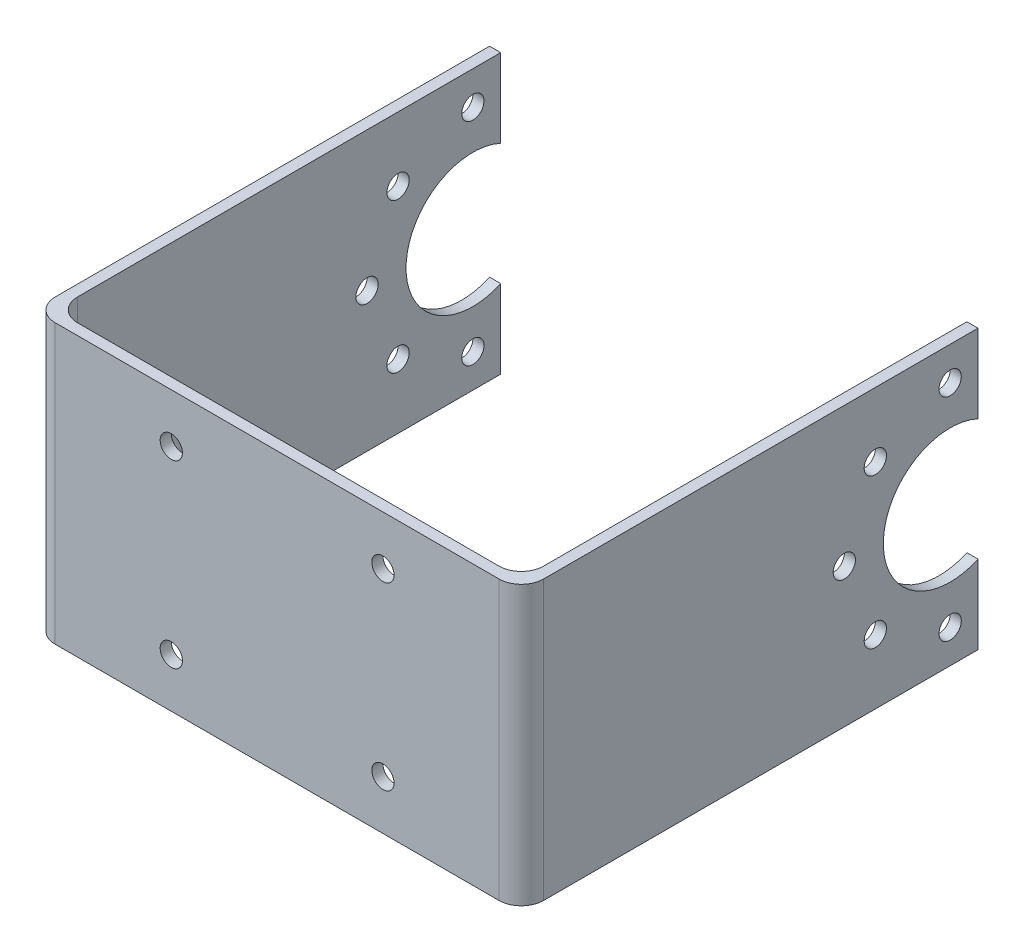
ISO-10303-21;
HEADER;
FILE_DESCRIPTION(('STEP AP214'),'2;1');
FILE_NAME('part.step','',(''),(''),'','','');
FILE_SCHEMA(('AUTOMOTIVE_DESIGN { 1 0 10303 214 1 1 1 1 }'));
ENDSEC;
DATA;
#1=APPLICATION_CONTEXT('core data for automotive mechanical design processes');
#2=APPLICATION_PROTOCOL_DEFINITION('international standard','automotive_design',2000,#1);
#3=PRODUCT_CONTEXT('',#1,'mechanical');
#4=PRODUCT('Part','Part','',(#3));
#5=PRODUCT_RELATED_PRODUCT_CATEGORY('part','',(#4));
#6=PRODUCT_DEFINITION_FORMATION('','',#4);
#7=PRODUCT_DEFINITION_CONTEXT('part definition',#1,'design');
#8=PRODUCT_DEFINITION('design','',#6,#7);
#9=PRODUCT_DEFINITION_SHAPE('','',#8);
#10=(LENGTH_UNIT() NAMED_UNIT(*) SI_UNIT(.MILLI.,.METRE.));
#11=(NAMED_UNIT(*) PLANE_ANGLE_UNIT() SI_UNIT($,.RADIAN.));
#12=(NAMED_UNIT(*) SI_UNIT($,.STERADIAN.) SOLID_ANGLE_UNIT());
#13=UNCERTAINTY_MEASURE_WITH_UNIT(LENGTH_MEASURE(1.E-05),#10,'distance_accuracy_value','');
#14=(GEOMETRIC_REPRESENTATION_CONTEXT(3) GLOBAL_UNCERTAINTY_ASSIGNED_CONTEXT((#13)) GLOBAL_UNIT_ASSIGNED_CONTEXT((#10,
#11,#12)) REPRESENTATION_CONTEXT('',''));
#15=CARTESIAN_POINT('',(0.,0.,0.));
#16=DIRECTION('',(0.,0.,1.));
#17=DIRECTION('',(1.,0.,0.));
#18=AXIS2_PLACEMENT_3D('',#15,#16,#17);
#19=CARTESIAN_POINT('',(21.3500000000001,25.,-40.5));
#20=DIRECTION('',(0.,0.,1.));
#21=DIRECTION('',(1.,0.,0.));
#22=AXIS2_PLACEMENT_3D('',#19,#20,#21);
#23=PLANE('',#22);
#24=DIRECTION('',(0.,-1.,0.));
#25=VECTOR('',#24,1.);
#26=CARTESIAN_POINT('',(20.3500000000001,25.,-40.5));
#27=LINE('',#26,#25);
#28=CARTESIAN_POINT('',(20.3500000000001,7.04564394268216,-40.5));
#29=VERTEX_POINT('',#28);
#30=CARTESIAN_POINT('',(20.3500000000001,0.,-40.5));
#31=VERTEX_POINT('',#30);
#32=EDGE_CURVE('E213',#29,#31,#27,.T.);
#33=ORIENTED_EDGE('',*,*,#32,.F.);
#34=DIRECTION('',(1.,0.,0.));
#35=VECTOR('',#34,1.);
#36=CARTESIAN_POINT('',(-22.4999999999999,7.04564394268215,-40.5));
#37=LINE('',#36,#35);
#38=CARTESIAN_POINT('',(21.3500000000001,7.04564394268215,-40.5));
#39=VERTEX_POINT('',#38);
#40=EDGE_CURVE('E197',#29,#39,#37,.T.);
#41=ORIENTED_EDGE('',*,*,#40,.T.);
#42=DIRECTION('',(0.,-1.,0.));
#43=VECTOR('',#42,1.);
#44=CARTESIAN_POINT('',(21.3500000000001,25.,-40.5));
#45=LINE('',#44,#43);
#46=CARTESIAN_POINT('',(21.3500000000001,0.,-40.5));
#47=VERTEX_POINT('',#46);
#48=EDGE_CURVE('E217',#39,#47,#45,.T.);
#49=ORIENTED_EDGE('',*,*,#48,.T.);
#50=DIRECTION('',(-1.,0.,0.));
#51=VECTOR('',#50,1.);
#52=CARTESIAN_POINT('',(21.3500000000001,0.,-40.5));
#53=LINE('',#52,#51);
#54=EDGE_CURVE('E269',#47,#31,#53,.T.);
#55=ORIENTED_EDGE('',*,*,#54,.T.);
#56=EDGE_LOOP('',(#33,#41,#49,#55));
#57=FACE_BOUND('',#56,.T.);
#58=ADVANCED_FACE('F62',(#57),#23,.F.);
#59=CARTESIAN_POINT('',(-22.4999999999999,25.,-40.5));
#60=DIRECTION('',(0.,0.,1.));
#61=DIRECTION('',(1.,0.,0.));
#62=AXIS2_PLACEMENT_3D('',#59,#60,#61);
#63=PLANE('',#62);
#64=DIRECTION('',(0.,-1.,0.));
#65=VECTOR('',#64,1.);
#66=CARTESIAN_POINT('',(-22.4999999999999,25.,-40.5));
#67=LINE('',#66,#65);
#68=CARTESIAN_POINT('',(-22.4999999999999,7.04564394268215,-40.5));
#69=VERTEX_POINT('',#68);
#70=CARTESIAN_POINT('',(-22.4999999999999,0.,-40.5));
#71=VERTEX_POINT('',#70);
#72=EDGE_CURVE('E204',#69,#71,#67,.T.);
#73=ORIENTED_EDGE('',*,*,#72,.F.);
#74=CARTESIAN_POINT('',(-21.4999999999999,7.04564394268215,-40.5));
#75=VERTEX_POINT('',#74);
#76=EDGE_CURVE('E181',#69,#75,#37,.T.);
#77=ORIENTED_EDGE('',*,*,#76,.T.);
#78=DIRECTION('',(0.,-1.,0.));
#79=VECTOR('',#78,1.);
#80=CARTESIAN_POINT('',(-21.4999999999999,25.,-40.5));
#81=LINE('',#80,#79);
#82=CARTESIAN_POINT('',(-21.4999999999999,0.,-40.5));
#83=VERTEX_POINT('',#82);
#84=EDGE_CURVE('E203',#75,#83,#81,.T.);
#85=ORIENTED_EDGE('',*,*,#84,.T.);
#86=DIRECTION('',(-1.,0.,0.));
#87=VECTOR('',#86,1.);
#88=CARTESIAN_POINT('',(-22.4999999999999,0.,-40.5));
#89=LINE('',#88,#87);
#90=EDGE_CURVE('E295',#83,#71,#89,.T.);
#91=ORIENTED_EDGE('',*,*,#90,.T.);
#92=EDGE_LOOP('',(#73,#77,#85,#91));
#93=FACE_BOUND('',#92,.T.);
#94=ADVANCED_FACE('F447',(#93),#63,.F.);
#95=CARTESIAN_POINT('',(21.3500000000001,25.,-0.500000000000001));
#96=DIRECTION('',(-1.,0.,0.));
#97=DIRECTION('',(0.,0.,1.));
#98=AXIS2_PLACEMENT_3D('',#95,#96,#97);
#99=PLANE('',#98);
#100=CARTESIAN_POINT('',(21.3500000000001,5.7824855787278,-31.2824855787278));
#101=DIRECTION('',(1.,0.,0.));
#102=DIRECTION('',(0.,0.,-1.));
#103=AXIS2_PLACEMENT_3D('',#100,#101,#102);
#104=CIRCLE('',#103,0.999999999999998);
#105=CARTESIAN_POINT('',(21.3500000000001,5.7824855787278,-32.2824855787278));
#106=VERTEX_POINT('',#105);
#107=EDGE_CURVE('E367',#106,#106,#104,.T.);
#108=ORIENTED_EDGE('',*,*,#107,.F.);
#109=EDGE_LOOP('',(#108));
#110=FACE_BOUND('',#109,.T.);
#111=CARTESIAN_POINT('',(21.3500000000001,3.,-38.));
#112=DIRECTION('',(1.,0.,0.));
#113=DIRECTION('',(0.,0.,-1.));
#114=AXIS2_PLACEMENT_3D('',#111,#112,#113);
#115=CIRCLE('',#114,0.999999999999998);
#116=CARTESIAN_POINT('',(21.3500000000001,3.,-39.));
#117=VERTEX_POINT('',#116);
#118=EDGE_CURVE('E355',#117,#117,#115,.T.);
#119=ORIENTED_EDGE('',*,*,#118,.F.);
#120=EDGE_LOOP('',(#119));
#121=FACE_BOUND('',#120,.T.);
#122=CARTESIAN_POINT('',(21.3500000000001,12.5,-28.5));
#123=DIRECTION('',(1.,0.,0.));
#124=DIRECTION('',(0.,0.,-1.));
#125=AXIS2_PLACEMENT_3D('',#122,#123,#124);
#126=CIRCLE('',#125,1.);
#127=CARTESIAN_POINT('',(21.3500000000001,12.5,-29.5));
#128=VERTEX_POINT('',#127);
#129=EDGE_CURVE('E343',#128,#128,#126,.T.);
#130=ORIENTED_EDGE('',*,*,#129,.F.);
#131=EDGE_LOOP('',(#130));
#132=FACE_BOUND('',#131,.T.);
#133=CARTESIAN_POINT('',(21.3500000000001,19.2175144212722,-31.2824855787278));
#134=DIRECTION('',(1.,0.,0.));
#135=DIRECTION('',(0.,0.,-1.));
#136=AXIS2_PLACEMENT_3D('',#133,#134,#135);
#137=CIRCLE('',#136,1.00000000000001);
#138=CARTESIAN_POINT('',(21.3500000000001,19.2175144212722,-32.2824855787278));
#139=VERTEX_POINT('',#138);
#140=EDGE_CURVE('E331',#139,#139,#137,.T.);
#141=ORIENTED_EDGE('',*,*,#140,.F.);
#142=EDGE_LOOP('',(#141));
#143=FACE_BOUND('',#142,.T.);
#144=CARTESIAN_POINT('',(21.3500000000001,22.,-38.));
#145=DIRECTION('',(1.,0.,0.));
#146=DIRECTION('',(0.,0.,-1.));
#147=AXIS2_PLACEMENT_3D('',#144,#145,#146);
#148=CIRCLE('',#147,0.999999999999998);
#149=CARTESIAN_POINT('',(21.3500000000001,22.,-39.));
#150=VERTEX_POINT('',#149);
#151=EDGE_CURVE('E319',#150,#150,#148,.T.);
#152=ORIENTED_EDGE('',*,*,#151,.F.);
#153=EDGE_LOOP('',(#152));
#154=FACE_BOUND('',#153,.T.);
#155=DIRECTION('',(0.,0.,-1.));
#156=VECTOR('',#155,1.);
#157=CARTESIAN_POINT('',(21.3500000000001,25.,-0.500000000000001));
#158=LINE('',#157,#156);
#159=CARTESIAN_POINT('',(21.3500000000001,25.,-1.5));
#160=VERTEX_POINT('',#159);
#161=CARTESIAN_POINT('',(21.3500000000001,25.,-40.5));
#162=VERTEX_POINT('',#161);
#163=EDGE_CURVE('E301',#160,#162,#158,.T.);
#164=ORIENTED_EDGE('',*,*,#163,.F.);
#165=DIRECTION('',(0.,-1.,0.));
#166=VECTOR('',#165,1.);
#167=CARTESIAN_POINT('',(21.3500000000001,25.,-1.5));
#168=LINE('',#167,#166);
#169=CARTESIAN_POINT('',(21.3500000000001,0.,-1.5));
#170=VERTEX_POINT('',#169);
#171=EDGE_CURVE('E243',#160,#170,#168,.T.);
#172=ORIENTED_EDGE('',*,*,#171,.T.);
#173=DIRECTION('',(0.,0.,-1.));
#174=VECTOR('',#173,1.);
#175=CARTESIAN_POINT('',(21.3500000000001,0.,-0.500000000000001));
#176=LINE('',#175,#174);
#177=EDGE_CURVE('E288',#170,#47,#176,.T.);
#178=ORIENTED_EDGE('',*,*,#177,.T.);
#179=ORIENTED_EDGE('',*,*,#48,.F.);
#180=CARTESIAN_POINT('',(21.3500000000001,12.5,-38.));
#181=DIRECTION('',(1.,0.,0.));
#182=DIRECTION('',(0.,0.,-1.));
#183=AXIS2_PLACEMENT_3D('',#180,#181,#182);
#184=CIRCLE('',#183,5.99999999999999);
#185=CARTESIAN_POINT('',(21.3500000000001,17.9543560573178,-40.5));
#186=VERTEX_POINT('',#185);
#187=EDGE_CURVE('E186',#186,#39,#184,.T.);
#188=ORIENTED_EDGE('',*,*,#187,.F.);
#189=EDGE_CURVE('E218',#162,#186,#45,.T.);
#190=ORIENTED_EDGE('',*,*,#189,.F.);
#191=EDGE_LOOP('',(#164,#172,#178,#179,#188,#190));
#192=FACE_BOUND('',#191,.T.);
#193=ADVANCED_FACE('F422',(#110,#121,#132,#143,#154,#192),#99,.F.);
#194=ORIENTED_EDGE('',*,*,#189,.T.);
#195=DIRECTION('',(1.,0.,0.));
#196=VECTOR('',#195,1.);
#197=CARTESIAN_POINT('',(-22.4999999999999,17.9543560573178,-40.5));
#198=LINE('',#197,#196);
#199=CARTESIAN_POINT('',(20.3500000000001,17.9543560573178,-40.5));
#200=VERTEX_POINT('',#199);
#201=EDGE_CURVE('E185',#200,#186,#198,.T.);
#202=ORIENTED_EDGE('',*,*,#201,.F.);
#203=CARTESIAN_POINT('',(20.3500000000001,25.,-40.5));
#204=VERTEX_POINT('',#203);
#205=EDGE_CURVE('E214',#204,#200,#27,.T.);
#206=ORIENTED_EDGE('',*,*,#205,.F.);
#207=DIRECTION('',(-1.,0.,0.));
#208=VECTOR('',#207,1.);
#209=CARTESIAN_POINT('',(21.3500000000001,25.,-40.5));
#210=LINE('',#209,#208);
#211=EDGE_CURVE('E280',#162,#204,#210,.T.);
#212=ORIENTED_EDGE('',*,*,#211,.F.);
#213=EDGE_LOOP('',(#194,#202,#206,#212));
#214=FACE_BOUND('',#213,.T.);
#215=ADVANCED_FACE('F430',(#214),#23,.F.);
#216=CARTESIAN_POINT('',(20.3500000000001,25.,-0.499999999999996));
#217=DIRECTION('',(1.,0.,0.));
#218=DIRECTION('',(0.,0.,-1.));
#219=AXIS2_PLACEMENT_3D('',#216,#217,#218);
#220=PLANE('',#219);
#221=CARTESIAN_POINT('',(20.3500000000001,5.7824855787278,-31.2824855787278));
#222=DIRECTION('',(1.,0.,0.));
#223=DIRECTION('',(0.,0.,-1.));
#224=AXIS2_PLACEMENT_3D('',#221,#222,#223);
#225=CIRCLE('',#224,0.999999999999998);
#226=CARTESIAN_POINT('',(20.3500000000001,5.7824855787278,-32.2824855787278));
#227=VERTEX_POINT('',#226);
#228=EDGE_CURVE('E359',#227,#227,#225,.T.);
#229=ORIENTED_EDGE('',*,*,#228,.T.);
#230=EDGE_LOOP('',(#229));
#231=FACE_BOUND('',#230,.T.);
#232=CARTESIAN_POINT('',(20.3500000000001,3.,-38.));
#233=DIRECTION('',(1.,0.,0.));
#234=DIRECTION('',(0.,0.,-1.));
#235=AXIS2_PLACEMENT_3D('',#232,#233,#234);
#236=CIRCLE('',#235,0.999999999999998);
#237=CARTESIAN_POINT('',(20.3500000000001,3.,-39.));
#238=VERTEX_POINT('',#237);
#239=EDGE_CURVE('E347',#238,#238,#236,.T.);
#240=ORIENTED_EDGE('',*,*,#239,.T.);
#241=EDGE_LOOP('',(#240));
#242=FACE_BOUND('',#241,.T.);
#243=CARTESIAN_POINT('',(20.3500000000001,12.5,-28.5));
#244=DIRECTION('',(1.,0.,0.));
#245=DIRECTION('',(0.,0.,-1.));
#246=AXIS2_PLACEMENT_3D('',#243,#244,#245);
#247=CIRCLE('',#246,1.);
#248=CARTESIAN_POINT('',(20.3500000000001,12.5,-29.5));
#249=VERTEX_POINT('',#248);
#250=EDGE_CURVE('E335',#249,#249,#247,.T.);
#251=ORIENTED_EDGE('',*,*,#250,.T.);
#252=EDGE_LOOP('',(#251));
#253=FACE_BOUND('',#252,.T.);
#254=CARTESIAN_POINT('',(20.3500000000001,19.2175144212722,-31.2824855787278));
#255=DIRECTION('',(1.,0.,0.));
#256=DIRECTION('',(0.,0.,-1.));
#257=AXIS2_PLACEMENT_3D('',#254,#255,#256);
#258=CIRCLE('',#257,1.00000000000001);
#259=CARTESIAN_POINT('',(20.3500000000001,19.2175144212722,-32.2824855787278));
#260=VERTEX_POINT('',#259);
#261=EDGE_CURVE('E323',#260,#260,#258,.T.);
#262=ORIENTED_EDGE('',*,*,#261,.T.);
#263=EDGE_LOOP('',(#262));
#264=FACE_BOUND('',#263,.T.);
#265=CARTESIAN_POINT('',(20.3500000000001,22.,-38.));
#266=DIRECTION('',(1.,0.,0.));
#267=DIRECTION('',(0.,0.,-1.));
#268=AXIS2_PLACEMENT_3D('',#265,#266,#267);
#269=CIRCLE('',#268,0.999999999999998);
#270=CARTESIAN_POINT('',(20.3500000000001,22.,-39.));
#271=VERTEX_POINT('',#270);
#272=EDGE_CURVE('E312',#271,#271,#269,.T.);
#273=ORIENTED_EDGE('',*,*,#272,.T.);
#274=EDGE_LOOP('',(#273));
#275=FACE_BOUND('',#274,.T.);
#276=DIRECTION('',(0.,0.,1.));
#277=VECTOR('',#276,1.);
#278=CARTESIAN_POINT('',(20.3500000000001,0.,-0.499999999999996));
#279=LINE('',#278,#277);
#280=CARTESIAN_POINT('',(20.3500000000001,0.,-2.5));
#281=VERTEX_POINT('',#280);
#282=EDGE_CURVE('E257',#31,#281,#279,.T.);
#283=ORIENTED_EDGE('',*,*,#282,.T.);
#284=DIRECTION('',(0.,-1.,0.));
#285=VECTOR('',#284,1.);
#286=CARTESIAN_POINT('',(20.3500000000001,25.,-2.5));
#287=LINE('',#286,#285);
#288=CARTESIAN_POINT('',(20.3500000000001,25.,-2.5));
#289=VERTEX_POINT('',#288);
#290=EDGE_CURVE('E246',#281,#289,#287,.F.);
#291=ORIENTED_EDGE('',*,*,#290,.T.);
#292=DIRECTION('',(0.,0.,1.));
#293=VECTOR('',#292,1.);
#294=CARTESIAN_POINT('',(20.3500000000001,25.,-0.499999999999996));
#295=LINE('',#294,#293);
#296=EDGE_CURVE('E274',#204,#289,#295,.T.);
#297=ORIENTED_EDGE('',*,*,#296,.F.);
#298=ORIENTED_EDGE('',*,*,#205,.T.);
#299=CARTESIAN_POINT('',(20.3500000000001,12.5,-38.));
#300=DIRECTION('',(1.,0.,0.));
#301=DIRECTION('',(0.,0.,-1.));
#302=AXIS2_PLACEMENT_3D('',#299,#300,#301);
#303=CIRCLE('',#302,5.99999999999999);
#304=EDGE_CURVE('E290',#200,#29,#303,.T.);
#305=ORIENTED_EDGE('',*,*,#304,.T.);
#306=ORIENTED_EDGE('',*,*,#32,.T.);
#307=EDGE_LOOP('',(#283,#291,#297,#298,#305,#306));
#308=FACE_BOUND('',#307,.T.);
#309=ADVANCED_FACE('F263',(#231,#242,#253,#264,#275,#308),#220,.F.);
#310=CARTESIAN_POINT('',(-21.4999999999999,25.,-0.499999999999996));
#311=DIRECTION('',(0.,0.,1.));
#312=DIRECTION('',(1.,0.,0.));
#313=AXIS2_PLACEMENT_3D('',#310,#311,#312);
#314=PLANE('',#313);
#315=CARTESIAN_POINT('',(8.92500000000006,4.415,-0.499999999999994));
#316=DIRECTION('',(0.,0.,1.));
#317=DIRECTION('',(1.,0.,0.));
#318=AXIS2_PLACEMENT_3D('',#315,#316,#317);
#319=CIRCLE('',#318,1.);
#320=CARTESIAN_POINT('',(9.92500000000006,4.415,-0.499999999999994));
#321=VERTEX_POINT('',#320);
#322=EDGE_CURVE('E391',#321,#321,#319,.T.);
#323=ORIENTED_EDGE('',*,*,#322,.T.);
#324=EDGE_LOOP('',(#323));
#325=FACE_BOUND('',#324,.T.);
#326=CARTESIAN_POINT('',(8.92500000000006,20.585,-0.499999999999994));
#327=DIRECTION('',(0.,0.,1.));
#328=DIRECTION('',(1.,0.,0.));
#329=AXIS2_PLACEMENT_3D('',#326,#327,#328);
#330=CIRCLE('',#329,1.);
#331=CARTESIAN_POINT('',(9.92500000000006,20.585,-0.499999999999994));
#332=VERTEX_POINT('',#331);
#333=EDGE_CURVE('E385',#332,#332,#330,.T.);
#334=ORIENTED_EDGE('',*,*,#333,.T.);
#335=EDGE_LOOP('',(#334));
#336=FACE_BOUND('',#335,.T.);
#337=CARTESIAN_POINT('',(-10.0749999999999,4.415,-0.499999999999994));
#338=DIRECTION('',(0.,0.,1.));
#339=DIRECTION('',(1.,0.,0.));
#340=AXIS2_PLACEMENT_3D('',#337,#338,#339);
#341=CIRCLE('',#340,1.);
#342=CARTESIAN_POINT('',(-9.07499999999994,4.415,-0.499999999999994));
#343=VERTEX_POINT('',#342);
#344=EDGE_CURVE('E379',#343,#343,#341,.T.);
#345=ORIENTED_EDGE('',*,*,#344,.T.);
#346=EDGE_LOOP('',(#345));
#347=FACE_BOUND('',#346,.T.);
#348=CARTESIAN_POINT('',(-10.0749999999999,20.585,-0.499999999999994));
#349=DIRECTION('',(0.,0.,1.));
#350=DIRECTION('',(1.,0.,0.));
#351=AXIS2_PLACEMENT_3D('',#348,#349,#350);
#352=CIRCLE('',#351,1.);
#353=CARTESIAN_POINT('',(-9.07499999999994,20.585,-0.499999999999994));
#354=VERTEX_POINT('',#353);
#355=EDGE_CURVE('E371',#354,#354,#352,.T.);
#356=ORIENTED_EDGE('',*,*,#355,.T.);
#357=EDGE_LOOP('',(#356));
#358=FACE_BOUND('',#357,.T.);
#359=DIRECTION('',(-1.,0.,0.));
#360=VECTOR('',#359,1.);
#361=CARTESIAN_POINT('',(-21.4999999999999,0.,-0.499999999999996));
#362=LINE('',#361,#360);
#363=CARTESIAN_POINT('',(18.35,0.,-0.499999999999996));
#364=VERTEX_POINT('',#363);
#365=CARTESIAN_POINT('',(-19.4999999999999,0.,-0.499999999999996));
#366=VERTEX_POINT('',#365);
#367=EDGE_CURVE('E258',#364,#366,#362,.T.);
#368=ORIENTED_EDGE('',*,*,#367,.T.);
#369=DIRECTION('',(0.,-1.,0.));
#370=VECTOR('',#369,1.);
#371=CARTESIAN_POINT('',(-19.4999999999999,25.,-0.499999999999996));
#372=LINE('',#371,#370);
#373=CARTESIAN_POINT('',(-19.4999999999999,25.,-0.499999999999996));
#374=VERTEX_POINT('',#373);
#375=EDGE_CURVE('E85',#366,#374,#372,.F.);
#376=ORIENTED_EDGE('',*,*,#375,.T.);
#377=DIRECTION('',(-1.,0.,0.));
#378=VECTOR('',#377,1.);
#379=CARTESIAN_POINT('',(-21.4999999999999,25.,-0.499999999999996));
#380=LINE('',#379,#378);
#381=CARTESIAN_POINT('',(18.35,25.,-0.499999999999996));
#382=VERTEX_POINT('',#381);
#383=EDGE_CURVE('E273',#382,#374,#380,.T.);
#384=ORIENTED_EDGE('',*,*,#383,.F.);
#385=DIRECTION('',(0.,-1.,0.));
#386=VECTOR('',#385,1.);
#387=CARTESIAN_POINT('',(18.3500000000001,0.,-0.499999999999996));
#388=LINE('',#387,#386);
#389=EDGE_CURVE('E239',#382,#364,#388,.T.);
#390=ORIENTED_EDGE('',*,*,#389,.T.);
#391=EDGE_LOOP('',(#368,#376,#384,#390));
#392=FACE_BOUND('',#391,.T.);
#393=ADVANCED_FACE('F275',(#325,#336,#347,#358,#392),#314,.F.);
#394=CARTESIAN_POINT('',(-21.4999999999999,25.,-0.499999999999996));
#395=DIRECTION('',(-1.,0.,0.));
#396=DIRECTION('',(0.,0.,1.));
#397=AXIS2_PLACEMENT_3D('',#394,#395,#396);
#398=PLANE('',#397);
#399=CARTESIAN_POINT('',(-21.4999999999999,5.7824855787278,-31.2824855787278));
#400=DIRECTION('',(-1.,0.,0.));
#401=DIRECTION('',(0.,0.,1.));
#402=AXIS2_PLACEMENT_3D('',#399,#400,#401);
#403=CIRCLE('',#402,0.999999999999998);
#404=CARTESIAN_POINT('',(-21.4999999999999,5.7824855787278,-30.2824855787278));
#405=VERTEX_POINT('',#404);
#406=EDGE_CURVE('E364',#405,#405,#403,.T.);
#407=ORIENTED_EDGE('',*,*,#406,.T.);
#408=EDGE_LOOP('',(#407));
#409=FACE_BOUND('',#408,.T.);
#410=CARTESIAN_POINT('',(-21.4999999999999,3.,-38.));
#411=DIRECTION('',(-1.,0.,0.));
#412=DIRECTION('',(0.,0.,1.));
#413=AXIS2_PLACEMENT_3D('',#410,#411,#412);
#414=CIRCLE('',#413,0.999999999999998);
#415=CARTESIAN_POINT('',(-21.4999999999999,3.,-37.));
#416=VERTEX_POINT('',#415);
#417=EDGE_CURVE('E352',#416,#416,#414,.T.);
#418=ORIENTED_EDGE('',*,*,#417,.T.);
#419=EDGE_LOOP('',(#418));
#420=FACE_BOUND('',#419,.T.);
#421=CARTESIAN_POINT('',(-21.4999999999999,12.5,-28.5));
#422=DIRECTION('',(-1.,0.,0.));
#423=DIRECTION('',(0.,0.,1.));
#424=AXIS2_PLACEMENT_3D('',#421,#422,#423);
#425=CIRCLE('',#424,1.);
#426=CARTESIAN_POINT('',(-21.4999999999999,12.5,-27.5));
#427=VERTEX_POINT('',#426);
#428=EDGE_CURVE('E340',#427,#427,#425,.T.);
#429=ORIENTED_EDGE('',*,*,#428,.T.);
#430=EDGE_LOOP('',(#429));
#431=FACE_BOUND('',#430,.T.);
#432=CARTESIAN_POINT('',(-21.4999999999999,19.2175144212722,-31.2824855787278));
#433=DIRECTION('',(-1.,0.,0.));
#434=DIRECTION('',(0.,0.,1.));
#435=AXIS2_PLACEMENT_3D('',#432,#433,#434);
#436=CIRCLE('',#435,1.00000000000001);
#437=CARTESIAN_POINT('',(-21.4999999999999,19.2175144212722,-30.2824855787278));
#438=VERTEX_POINT('',#437);
#439=EDGE_CURVE('E328',#438,#438,#436,.T.);
#440=ORIENTED_EDGE('',*,*,#439,.T.);
#441=EDGE_LOOP('',(#440));
#442=FACE_BOUND('',#441,.T.);
#443=CARTESIAN_POINT('',(-21.4999999999999,22.,-38.));
#444=DIRECTION('',(-1.,0.,0.));
#445=DIRECTION('',(0.,0.,1.));
#446=AXIS2_PLACEMENT_3D('',#443,#444,#445);
#447=CIRCLE('',#446,0.999999999999998);
#448=CARTESIAN_POINT('',(-21.4999999999999,22.,-37.));
#449=VERTEX_POINT('',#448);
#450=EDGE_CURVE('E316',#449,#449,#447,.T.);
#451=ORIENTED_EDGE('',*,*,#450,.T.);
#452=EDGE_LOOP('',(#451));
#453=FACE_BOUND('',#452,.T.);
#454=DIRECTION('',(0.,0.,-1.));
#455=VECTOR('',#454,1.);
#456=CARTESIAN_POINT('',(-21.4999999999999,25.,-0.499999999999996));
#457=LINE('',#456,#455);
#458=CARTESIAN_POINT('',(-21.4999999999999,25.,-2.5));
#459=VERTEX_POINT('',#458);
#460=CARTESIAN_POINT('',(-21.4999999999999,25.,-40.5));
#461=VERTEX_POINT('',#460);
#462=EDGE_CURVE('E276',#459,#461,#457,.T.);
#463=ORIENTED_EDGE('',*,*,#462,.F.);
#464=DIRECTION('',(0.,-1.,0.));
#465=VECTOR('',#464,1.);
#466=CARTESIAN_POINT('',(-21.4999999999999,0.,-2.5));
#467=LINE('',#466,#465);
#468=CARTESIAN_POINT('',(-21.4999999999999,0.,-2.5));
#469=VERTEX_POINT('',#468);
#470=EDGE_CURVE('E236',#459,#469,#467,.T.);
#471=ORIENTED_EDGE('',*,*,#470,.T.);
#472=DIRECTION('',(0.,0.,-1.));
#473=VECTOR('',#472,1.);
#474=CARTESIAN_POINT('',(-21.4999999999999,0.,-0.499999999999996));
#475=LINE('',#474,#473);
#476=EDGE_CURVE('E293',#469,#83,#475,.T.);
#477=ORIENTED_EDGE('',*,*,#476,.T.);
#478=ORIENTED_EDGE('',*,*,#84,.F.);
#479=CARTESIAN_POINT('',(-21.4999999999999,12.5,-38.));
#480=DIRECTION('',(-1.,0.,0.));
#481=DIRECTION('',(0.,0.,1.));
#482=AXIS2_PLACEMENT_3D('',#479,#480,#481);
#483=CIRCLE('',#482,5.99999999999999);
#484=CARTESIAN_POINT('',(-21.4999999999999,17.9543560573178,-40.5));
#485=VERTEX_POINT('',#484);
#486=EDGE_CURVE('E309',#75,#485,#483,.T.);
#487=ORIENTED_EDGE('',*,*,#486,.T.);
#488=EDGE_CURVE('E196',#461,#485,#81,.T.);
#489=ORIENTED_EDGE('',*,*,#488,.F.);
#490=EDGE_LOOP('',(#463,#471,#477,#478,#487,#489));
#491=FACE_BOUND('',#490,.T.);
#492=ADVANCED_FACE('F529',(#409,#420,#431,#442,#453,#491),#398,.F.);
#493=ORIENTED_EDGE('',*,*,#488,.T.);
#494=CARTESIAN_POINT('',(-22.4999999999999,17.9543560573178,-40.5));
#495=VERTEX_POINT('',#494);
#496=EDGE_CURVE('E178',#495,#485,#198,.T.);
#497=ORIENTED_EDGE('',*,*,#496,.F.);
#498=CARTESIAN_POINT('',(-22.4999999999999,25.,-40.5));
#499=VERTEX_POINT('',#498);
#500=EDGE_CURVE('E193',#499,#495,#67,.T.);
#501=ORIENTED_EDGE('',*,*,#500,.F.);
#502=DIRECTION('',(-1.,0.,0.));
#503=VECTOR('',#502,1.);
#504=CARTESIAN_POINT('',(-22.4999999999999,25.,-40.5));
#505=LINE('',#504,#503);
#506=EDGE_CURVE('E278',#461,#499,#505,.T.);
#507=ORIENTED_EDGE('',*,*,#506,.F.);
#508=EDGE_LOOP('',(#493,#497,#501,#507));
#509=FACE_BOUND('',#508,.T.);
#510=ADVANCED_FACE('F191',(#509),#63,.F.);
#511=CARTESIAN_POINT('',(-22.4999999999999,25.,-0.499999999999996));
#512=DIRECTION('',(1.,0.,0.));
#513=DIRECTION('',(0.,0.,-1.));
#514=AXIS2_PLACEMENT_3D('',#511,#512,#513);
#515=PLANE('',#514);
#516=CARTESIAN_POINT('',(-22.4999999999999,5.7824855787278,-31.2824855787278));
#517=DIRECTION('',(1.,0.,0.));
#518=DIRECTION('',(0.,0.,-1.));
#519=AXIS2_PLACEMENT_3D('',#516,#517,#518);
#520=CIRCLE('',#519,0.999999999999998);
#521=CARTESIAN_POINT('',(-22.4999999999999,5.7824855787278,-32.2824855787278));
#522=VERTEX_POINT('',#521);
#523=EDGE_CURVE('E368',#522,#522,#520,.T.);
#524=ORIENTED_EDGE('',*,*,#523,.T.);
#525=EDGE_LOOP('',(#524));
#526=FACE_BOUND('',#525,.T.);
#527=CARTESIAN_POINT('',(-22.4999999999999,3.,-38.));
#528=DIRECTION('',(1.,0.,0.));
#529=DIRECTION('',(0.,0.,-1.));
#530=AXIS2_PLACEMENT_3D('',#527,#528,#529);
#531=CIRCLE('',#530,0.999999999999998);
#532=CARTESIAN_POINT('',(-22.4999999999999,3.,-39.));
#533=VERTEX_POINT('',#532);
#534=EDGE_CURVE('E356',#533,#533,#531,.T.);
#535=ORIENTED_EDGE('',*,*,#534,.T.);
#536=EDGE_LOOP('',(#535));
#537=FACE_BOUND('',#536,.T.);
#538=CARTESIAN_POINT('',(-22.4999999999999,12.5,-28.5));
#539=DIRECTION('',(1.,0.,0.));
#540=DIRECTION('',(0.,0.,-1.));
#541=AXIS2_PLACEMENT_3D('',#538,#539,#540);
#542=CIRCLE('',#541,1.);
#543=CARTESIAN_POINT('',(-22.4999999999999,12.5,-29.5));
#544=VERTEX_POINT('',#543);
#545=EDGE_CURVE('E344',#544,#544,#542,.T.);
#546=ORIENTED_EDGE('',*,*,#545,.T.);
#547=EDGE_LOOP('',(#546));
#548=FACE_BOUND('',#547,.T.);
#549=CARTESIAN_POINT('',(-22.4999999999999,19.2175144212722,-31.2824855787278));
#550=DIRECTION('',(1.,0.,0.));
#551=DIRECTION('',(0.,0.,-1.));
#552=AXIS2_PLACEMENT_3D('',#549,#550,#551);
#553=CIRCLE('',#552,1.00000000000001);
#554=CARTESIAN_POINT('',(-22.4999999999999,19.2175144212722,-32.2824855787278));
#555=VERTEX_POINT('',#554);
#556=EDGE_CURVE('E332',#555,#555,#553,.T.);
#557=ORIENTED_EDGE('',*,*,#556,.T.);
#558=EDGE_LOOP('',(#557));
#559=FACE_BOUND('',#558,.T.);
#560=CARTESIAN_POINT('',(-22.4999999999999,22.,-38.));
#561=DIRECTION('',(1.,0.,0.));
#562=DIRECTION('',(0.,0.,-1.));
#563=AXIS2_PLACEMENT_3D('',#560,#561,#562);
#564=CIRCLE('',#563,0.999999999999998);
#565=CARTESIAN_POINT('',(-22.4999999999999,22.,-39.));
#566=VERTEX_POINT('',#565);
#567=EDGE_CURVE('E320',#566,#566,#564,.T.);
#568=ORIENTED_EDGE('',*,*,#567,.T.);
#569=EDGE_LOOP('',(#568));
#570=FACE_BOUND('',#569,.T.);
#571=DIRECTION('',(0.,0.,1.));
#572=VECTOR('',#571,1.);
#573=CARTESIAN_POINT('',(-22.4999999999999,0.,-0.499999999999996));
#574=LINE('',#573,#572);
#575=CARTESIAN_POINT('',(-22.4999999999999,0.,-1.5));
#576=VERTEX_POINT('',#575);
#577=EDGE_CURVE('E297',#71,#576,#574,.T.);
#578=ORIENTED_EDGE('',*,*,#577,.T.);
#579=DIRECTION('',(0.,-1.,0.));
#580=VECTOR('',#579,1.);
#581=CARTESIAN_POINT('',(-22.4999999999999,25.,-1.5));
#582=LINE('',#581,#580);
#583=CARTESIAN_POINT('',(-22.4999999999999,25.,-1.5));
#584=VERTEX_POINT('',#583);
#585=EDGE_CURVE('E230',#576,#584,#582,.F.);
#586=ORIENTED_EDGE('',*,*,#585,.T.);
#587=DIRECTION('',(0.,0.,1.));
#588=VECTOR('',#587,1.);
#589=CARTESIAN_POINT('',(-22.4999999999999,25.,-0.499999999999996));
#590=LINE('',#589,#588);
#591=EDGE_CURVE('E202',#499,#584,#590,.T.);
#592=ORIENTED_EDGE('',*,*,#591,.F.);
#593=ORIENTED_EDGE('',*,*,#500,.T.);
#594=CARTESIAN_POINT('',(-22.4999999999999,12.5,-38.));
#595=DIRECTION('',(1.,0.,0.));
#596=DIRECTION('',(0.,0.,-1.));
#597=AXIS2_PLACEMENT_3D('',#594,#595,#596);
#598=CIRCLE('',#597,5.99999999999999);
#599=EDGE_CURVE('E175',#495,#69,#598,.T.);
#600=ORIENTED_EDGE('',*,*,#599,.T.);
#601=ORIENTED_EDGE('',*,*,#72,.T.);
#602=EDGE_LOOP('',(#578,#586,#592,#593,#600,#601));
#603=FACE_BOUND('',#602,.T.);
#604=ADVANCED_FACE('F200',(#526,#537,#548,#559,#570,#603),#515,.F.);
#605=CARTESIAN_POINT('',(-22.4999999999999,25.,0.499999999999999));
#606=DIRECTION('',(0.,0.,-1.));
#607=DIRECTION('',(-1.,0.,0.));
#608=AXIS2_PLACEMENT_3D('',#605,#606,#607);
#609=PLANE('',#608);
#610=CARTESIAN_POINT('',(8.92500000000006,4.415,0.499999999999999));
#611=DIRECTION('',(0.,0.,1.));
#612=DIRECTION('',(1.,0.,0.));
#613=AXIS2_PLACEMENT_3D('',#610,#611,#612);
#614=CIRCLE('',#613,1.);
#615=CARTESIAN_POINT('',(9.92500000000006,4.415,0.499999999999999));
#616=VERTEX_POINT('',#615);
#617=EDGE_CURVE('E394',#616,#616,#614,.T.);
#618=ORIENTED_EDGE('',*,*,#617,.F.);
#619=EDGE_LOOP('',(#618));
#620=FACE_BOUND('',#619,.T.);
#621=CARTESIAN_POINT('',(8.92500000000006,20.585,0.499999999999999));
#622=DIRECTION('',(0.,0.,1.));
#623=DIRECTION('',(1.,0.,0.));
#624=AXIS2_PLACEMENT_3D('',#621,#622,#623);
#625=CIRCLE('',#624,1.);
#626=CARTESIAN_POINT('',(9.92500000000006,20.585,0.499999999999999));
#627=VERTEX_POINT('',#626);
#628=EDGE_CURVE('E388',#627,#627,#625,.T.);
#629=ORIENTED_EDGE('',*,*,#628,.F.);
#630=EDGE_LOOP('',(#629));
#631=FACE_BOUND('',#630,.T.);
#632=CARTESIAN_POINT('',(-10.0749999999999,4.415,0.499999999999999));
#633=DIRECTION('',(0.,0.,1.));
#634=DIRECTION('',(1.,0.,0.));
#635=AXIS2_PLACEMENT_3D('',#632,#633,#634);
#636=CIRCLE('',#635,1.);
#637=CARTESIAN_POINT('',(-9.07499999999994,4.415,0.499999999999999));
#638=VERTEX_POINT('',#637);
#639=EDGE_CURVE('E382',#638,#638,#636,.T.);
#640=ORIENTED_EDGE('',*,*,#639,.F.);
#641=EDGE_LOOP('',(#640));
#642=FACE_BOUND('',#641,.T.);
#643=CARTESIAN_POINT('',(-10.0749999999999,20.585,0.499999999999999));
#644=DIRECTION('',(0.,0.,1.));
#645=DIRECTION('',(1.,0.,0.));
#646=AXIS2_PLACEMENT_3D('',#643,#644,#645);
#647=CIRCLE('',#646,1.);
#648=CARTESIAN_POINT('',(-9.07499999999994,20.585,0.499999999999999));
#649=VERTEX_POINT('',#648);
#650=EDGE_CURVE('E376',#649,#649,#647,.T.);
#651=ORIENTED_EDGE('',*,*,#650,.F.);
#652=EDGE_LOOP('',(#651));
#653=FACE_BOUND('',#652,.T.);
#654=DIRECTION('',(1.,0.,0.));
#655=VECTOR('',#654,1.);
#656=CARTESIAN_POINT('',(-22.4999999999999,25.,0.499999999999999));
#657=LINE('',#656,#655);
#658=CARTESIAN_POINT('',(-20.4999999999999,25.,0.499999999999999));
#659=VERTEX_POINT('',#658);
#660=CARTESIAN_POINT('',(19.3500000000001,25.,0.499999999999999));
#661=VERTEX_POINT('',#660);
#662=EDGE_CURVE('E208',#659,#661,#657,.T.);
#663=ORIENTED_EDGE('',*,*,#662,.F.);
#664=DIRECTION('',(0.,-1.,0.));
#665=VECTOR('',#664,1.);
#666=CARTESIAN_POINT('',(-20.4999999999999,25.,0.499999999999999));
#667=LINE('',#666,#665);
#668=CARTESIAN_POINT('',(-20.4999999999999,0.,0.499999999999999));
#669=VERTEX_POINT('',#668);
#670=EDGE_CURVE('E223',#659,#669,#667,.T.);
#671=ORIENTED_EDGE('',*,*,#670,.T.);
#672=DIRECTION('',(1.,0.,0.));
#673=VECTOR('',#672,1.);
#674=CARTESIAN_POINT('',(-22.4999999999999,0.,0.499999999999999));
#675=LINE('',#674,#673);
#676=CARTESIAN_POINT('',(19.3500000000001,0.,0.499999999999999));
#677=VERTEX_POINT('',#676);
#678=EDGE_CURVE('E210',#669,#677,#675,.T.);
#679=ORIENTED_EDGE('',*,*,#678,.T.);
#680=DIRECTION('',(0.,-1.,0.));
#681=VECTOR('',#680,1.);
#682=CARTESIAN_POINT('',(19.3500000000001,25.,0.499999999999999));
#683=LINE('',#682,#681);
#684=EDGE_CURVE('E221',#677,#661,#683,.F.);
#685=ORIENTED_EDGE('',*,*,#684,.T.);
#686=EDGE_LOOP('',(#663,#671,#679,#685));
#687=FACE_BOUND('',#686,.T.);
#688=ADVANCED_FACE('F401',(#620,#631,#642,#653,#687),#609,.F.);
#689=CARTESIAN_POINT('',(0.,25.,0.));
#690=DIRECTION('',(0.,1.,0.));
#691=DIRECTION('',(0.,0.,1.));
#692=AXIS2_PLACEMENT_3D('',#689,#690,#691);
#693=PLANE('',#692);
#694=ORIENTED_EDGE('',*,*,#591,.T.);
#695=CARTESIAN_POINT('',(-20.4999999999999,25.,-1.5));
#696=DIRECTION('',(0.,1.,0.));
#697=DIRECTION('',(0.,0.,1.));
#698=AXIS2_PLACEMENT_3D('',#695,#696,#697);
#699=CIRCLE('',#698,2.);
#700=EDGE_CURVE('E234',#584,#659,#699,.T.);
#701=ORIENTED_EDGE('',*,*,#700,.T.);
#702=ORIENTED_EDGE('',*,*,#662,.T.);
#703=CARTESIAN_POINT('',(19.3500000000001,25.,-1.5));
#704=DIRECTION('',(0.,1.,0.));
#705=DIRECTION('',(0.,0.,1.));
#706=AXIS2_PLACEMENT_3D('',#703,#704,#705);
#707=CIRCLE('',#706,2.);
#708=EDGE_CURVE('E232',#661,#160,#707,.T.);
#709=ORIENTED_EDGE('',*,*,#708,.T.);
#710=ORIENTED_EDGE('',*,*,#163,.T.);
#711=ORIENTED_EDGE('',*,*,#211,.T.);
#712=ORIENTED_EDGE('',*,*,#296,.T.);
#713=CARTESIAN_POINT('',(18.3500000000001,25.,-2.5));
#714=DIRECTION('',(0.,1.,0.));
#715=DIRECTION('',(0.,0.,1.));
#716=AXIS2_PLACEMENT_3D('',#713,#714,#715);
#717=CIRCLE('',#716,2.);
#718=EDGE_CURVE('E12',#289,#382,#717,.F.);
#719=ORIENTED_EDGE('',*,*,#718,.T.);
#720=ORIENTED_EDGE('',*,*,#383,.T.);
#721=CARTESIAN_POINT('',(-19.4999999999999,25.,-2.5));
#722=DIRECTION('',(0.,1.,0.));
#723=DIRECTION('',(0.,0.,1.));
#724=AXIS2_PLACEMENT_3D('',#721,#722,#723);
#725=CIRCLE('',#724,2.);
#726=EDGE_CURVE('E77',#374,#459,#725,.F.);
#727=ORIENTED_EDGE('',*,*,#726,.T.);
#728=ORIENTED_EDGE('',*,*,#462,.T.);
#729=ORIENTED_EDGE('',*,*,#506,.T.);
#730=EDGE_LOOP('',(#694,#701,#702,#709,#710,#711,#712,#719,#720,#727,#728,#729));
#731=FACE_BOUND('',#730,.T.);
#732=ADVANCED_FACE('F272',(#731),#693,.T.);
#733=CARTESIAN_POINT('',(0.,0.,0.));
#734=DIRECTION('',(0.,1.,0.));
#735=DIRECTION('',(0.,0.,1.));
#736=AXIS2_PLACEMENT_3D('',#733,#734,#735);
#737=PLANE('',#736);
#738=ORIENTED_EDGE('',*,*,#678,.F.);
#739=CARTESIAN_POINT('',(-20.4999999999999,0.,-1.5));
#740=DIRECTION('',(0.,1.,0.));
#741=DIRECTION('',(0.,0.,1.));
#742=AXIS2_PLACEMENT_3D('',#739,#740,#741);
#743=CIRCLE('',#742,2.);
#744=EDGE_CURVE('E228',#669,#576,#743,.F.);
#745=ORIENTED_EDGE('',*,*,#744,.T.);
#746=ORIENTED_EDGE('',*,*,#577,.F.);
#747=ORIENTED_EDGE('',*,*,#90,.F.);
#748=ORIENTED_EDGE('',*,*,#476,.F.);
#749=CARTESIAN_POINT('',(-19.4999999999999,0.,-2.5));
#750=DIRECTION('',(0.,1.,0.));
#751=DIRECTION('',(0.,0.,1.));
#752=AXIS2_PLACEMENT_3D('',#749,#750,#751);
#753=CIRCLE('',#752,2.);
#754=EDGE_CURVE('E248',#469,#366,#753,.T.);
#755=ORIENTED_EDGE('',*,*,#754,.T.);
#756=ORIENTED_EDGE('',*,*,#367,.F.);
#757=CARTESIAN_POINT('',(18.3500000000001,0.,-2.5));
#758=DIRECTION('',(0.,1.,0.));
#759=DIRECTION('',(0.,0.,1.));
#760=AXIS2_PLACEMENT_3D('',#757,#758,#759);
#761=CIRCLE('',#760,2.);
#762=EDGE_CURVE('E70',#364,#281,#761,.T.);
#763=ORIENTED_EDGE('',*,*,#762,.T.);
#764=ORIENTED_EDGE('',*,*,#282,.F.);
#765=ORIENTED_EDGE('',*,*,#54,.F.);
#766=ORIENTED_EDGE('',*,*,#177,.F.);
#767=CARTESIAN_POINT('',(19.3500000000001,0.,-1.5));
#768=DIRECTION('',(0.,1.,0.));
#769=DIRECTION('',(0.,0.,1.));
#770=AXIS2_PLACEMENT_3D('',#767,#768,#769);
#771=CIRCLE('',#770,2.);
#772=EDGE_CURVE('E226',#170,#677,#771,.F.);
#773=ORIENTED_EDGE('',*,*,#772,.T.);
#774=EDGE_LOOP('',(#738,#745,#746,#747,#748,#755,#756,#763,#764,#765,#766,#773));
#775=FACE_BOUND('',#774,.T.);
#776=ADVANCED_FACE('F255',(#775),#737,.F.);
#777=CARTESIAN_POINT('',(-22.4999999999999,12.5,-38.));
#778=DIRECTION('',(1.,0.,0.));
#779=DIRECTION('',(0.,0.,-1.));
#780=AXIS2_PLACEMENT_3D('',#777,#778,#779);
#781=CYLINDRICAL_SURFACE('',#780,5.99999999999999);
#782=ORIENTED_EDGE('',*,*,#76,.F.);
#783=ORIENTED_EDGE('',*,*,#599,.F.);
#784=ORIENTED_EDGE('',*,*,#496,.T.);
#785=ORIENTED_EDGE('',*,*,#486,.F.);
#786=EDGE_LOOP('',(#782,#783,#784,#785));
#787=FACE_BOUND('',#786,.T.);
#788=ADVANCED_FACE('F177',(#787),#781,.F.);
#789=ORIENTED_EDGE('',*,*,#201,.T.);
#790=ORIENTED_EDGE('',*,*,#187,.T.);
#791=ORIENTED_EDGE('',*,*,#40,.F.);
#792=ORIENTED_EDGE('',*,*,#304,.F.);
#793=EDGE_LOOP('',(#789,#790,#791,#792));
#794=FACE_BOUND('',#793,.T.);
#795=ADVANCED_FACE('F434',(#794),#781,.F.);
#796=CARTESIAN_POINT('',(-22.4999999999999,22.,-38.));
#797=DIRECTION('',(1.,0.,0.));
#798=DIRECTION('',(0.,0.,-1.));
#799=AXIS2_PLACEMENT_3D('',#796,#797,#798);
#800=CYLINDRICAL_SURFACE('',#799,0.999999999999998);
#801=ORIENTED_EDGE('',*,*,#567,.F.);
#802=EDGE_LOOP('',(#801));
#803=FACE_BOUND('',#802,.T.);
#804=ORIENTED_EDGE('',*,*,#450,.F.);
#805=EDGE_LOOP('',(#804));
#806=FACE_BOUND('',#805,.T.);
#807=ADVANCED_FACE('F436',(#803,#806),#800,.F.);
#808=ORIENTED_EDGE('',*,*,#151,.T.);
#809=EDGE_LOOP('',(#808));
#810=FACE_BOUND('',#809,.T.);
#811=ORIENTED_EDGE('',*,*,#272,.F.);
#812=EDGE_LOOP('',(#811));
#813=FACE_BOUND('',#812,.T.);
#814=ADVANCED_FACE('F442',(#810,#813),#800,.F.);
#815=CARTESIAN_POINT('',(-22.4999999999999,19.2175144212722,-31.2824855787278));
#816=DIRECTION('',(1.,0.,0.));
#817=DIRECTION('',(0.,0.,-1.));
#818=AXIS2_PLACEMENT_3D('',#815,#816,#817);
#819=CYLINDRICAL_SURFACE('',#818,1.00000000000001);
#820=ORIENTED_EDGE('',*,*,#556,.F.);
#821=EDGE_LOOP('',(#820));
#822=FACE_BOUND('',#821,.T.);
#823=ORIENTED_EDGE('',*,*,#439,.F.);
#824=EDGE_LOOP('',(#823));
#825=FACE_BOUND('',#824,.T.);
#826=ADVANCED_FACE('F510',(#822,#825),#819,.F.);
#827=ORIENTED_EDGE('',*,*,#140,.T.);
#828=EDGE_LOOP('',(#827));
#829=FACE_BOUND('',#828,.T.);
#830=ORIENTED_EDGE('',*,*,#261,.F.);
#831=EDGE_LOOP('',(#830));
#832=FACE_BOUND('',#831,.T.);
#833=ADVANCED_FACE('F508',(#829,#832),#819,.F.);
#834=CARTESIAN_POINT('',(-22.4999999999999,12.5,-28.5));
#835=DIRECTION('',(1.,0.,0.));
#836=DIRECTION('',(0.,0.,-1.));
#837=AXIS2_PLACEMENT_3D('',#834,#835,#836);
#838=CYLINDRICAL_SURFACE('',#837,1.);
#839=ORIENTED_EDGE('',*,*,#545,.F.);
#840=EDGE_LOOP('',(#839));
#841=FACE_BOUND('',#840,.T.);
#842=ORIENTED_EDGE('',*,*,#428,.F.);
#843=EDGE_LOOP('',(#842));
#844=FACE_BOUND('',#843,.T.);
#845=ADVANCED_FACE('F506',(#841,#844),#838,.F.);
#846=ORIENTED_EDGE('',*,*,#129,.T.);
#847=EDGE_LOOP('',(#846));
#848=FACE_BOUND('',#847,.T.);
#849=ORIENTED_EDGE('',*,*,#250,.F.);
#850=EDGE_LOOP('',(#849));
#851=FACE_BOUND('',#850,.T.);
#852=ADVANCED_FACE('F503',(#848,#851),#838,.F.);
#853=CARTESIAN_POINT('',(-22.4999999999999,3.,-38.));
#854=DIRECTION('',(1.,0.,0.));
#855=DIRECTION('',(0.,0.,-1.));
#856=AXIS2_PLACEMENT_3D('',#853,#854,#855);
#857=CYLINDRICAL_SURFACE('',#856,0.999999999999998);
#858=ORIENTED_EDGE('',*,*,#534,.F.);
#859=EDGE_LOOP('',(#858));
#860=FACE_BOUND('',#859,.T.);
#861=ORIENTED_EDGE('',*,*,#417,.F.);
#862=EDGE_LOOP('',(#861));
#863=FACE_BOUND('',#862,.T.);
#864=ADVANCED_FACE('F501',(#860,#863),#857,.F.);
#865=ORIENTED_EDGE('',*,*,#118,.T.);
#866=EDGE_LOOP('',(#865));
#867=FACE_BOUND('',#866,.T.);
#868=ORIENTED_EDGE('',*,*,#239,.F.);
#869=EDGE_LOOP('',(#868));
#870=FACE_BOUND('',#869,.T.);
#871=ADVANCED_FACE('F498',(#867,#870),#857,.F.);
#872=CARTESIAN_POINT('',(-22.4999999999999,5.7824855787278,-31.2824855787278));
#873=DIRECTION('',(1.,0.,0.));
#874=DIRECTION('',(0.,0.,-1.));
#875=AXIS2_PLACEMENT_3D('',#872,#873,#874);
#876=CYLINDRICAL_SURFACE('',#875,0.999999999999998);
#877=ORIENTED_EDGE('',*,*,#523,.F.);
#878=EDGE_LOOP('',(#877));
#879=FACE_BOUND('',#878,.T.);
#880=ORIENTED_EDGE('',*,*,#406,.F.);
#881=EDGE_LOOP('',(#880));
#882=FACE_BOUND('',#881,.T.);
#883=ADVANCED_FACE('F496',(#879,#882),#876,.F.);
#884=ORIENTED_EDGE('',*,*,#107,.T.);
#885=EDGE_LOOP('',(#884));
#886=FACE_BOUND('',#885,.T.);
#887=ORIENTED_EDGE('',*,*,#228,.F.);
#888=EDGE_LOOP('',(#887));
#889=FACE_BOUND('',#888,.T.);
#890=ADVANCED_FACE('F471',(#886,#889),#876,.F.);
#891=CARTESIAN_POINT('',(-20.4999999999999,25.,-1.5));
#892=DIRECTION('',(0.,-1.,0.));
#893=DIRECTION('',(0.,0.,-1.));
#894=AXIS2_PLACEMENT_3D('',#891,#892,#893);
#895=CYLINDRICAL_SURFACE('',#894,2.);
#896=ORIENTED_EDGE('',*,*,#700,.F.);
#897=ORIENTED_EDGE('',*,*,#585,.F.);
#898=ORIENTED_EDGE('',*,*,#744,.F.);
#899=ORIENTED_EDGE('',*,*,#670,.F.);
#900=EDGE_LOOP('',(#896,#897,#898,#899));
#901=FACE_BOUND('',#900,.T.);
#902=ADVANCED_FACE('F415',(#901),#895,.T.);
#903=CARTESIAN_POINT('',(-19.4999999999999,25.,-2.5));
#904=DIRECTION('',(0.,1.,0.));
#905=DIRECTION('',(0.,0.,1.));
#906=AXIS2_PLACEMENT_3D('',#903,#904,#905);
#907=CYLINDRICAL_SURFACE('',#906,2.);
#908=ORIENTED_EDGE('',*,*,#726,.F.);
#909=ORIENTED_EDGE('',*,*,#375,.F.);
#910=ORIENTED_EDGE('',*,*,#754,.F.);
#911=ORIENTED_EDGE('',*,*,#470,.F.);
#912=EDGE_LOOP('',(#908,#909,#910,#911));
#913=FACE_BOUND('',#912,.T.);
#914=ADVANCED_FACE('F470',(#913),#907,.F.);
#915=CARTESIAN_POINT('',(19.3500000000001,25.,-1.5));
#916=DIRECTION('',(0.,-1.,0.));
#917=DIRECTION('',(0.,0.,-1.));
#918=AXIS2_PLACEMENT_3D('',#915,#916,#917);
#919=CYLINDRICAL_SURFACE('',#918,2.);
#920=ORIENTED_EDGE('',*,*,#708,.F.);
#921=ORIENTED_EDGE('',*,*,#684,.F.);
#922=ORIENTED_EDGE('',*,*,#772,.F.);
#923=ORIENTED_EDGE('',*,*,#171,.F.);
#924=EDGE_LOOP('',(#920,#921,#922,#923));
#925=FACE_BOUND('',#924,.T.);
#926=ADVANCED_FACE('F420',(#925),#919,.T.);
#927=CARTESIAN_POINT('',(18.3500000000001,25.,-2.5));
#928=DIRECTION('',(0.,1.,0.));
#929=DIRECTION('',(0.,0.,1.));
#930=AXIS2_PLACEMENT_3D('',#927,#928,#929);
#931=CYLINDRICAL_SURFACE('',#930,2.);
#932=ORIENTED_EDGE('',*,*,#718,.F.);
#933=ORIENTED_EDGE('',*,*,#290,.F.);
#934=ORIENTED_EDGE('',*,*,#762,.F.);
#935=ORIENTED_EDGE('',*,*,#389,.F.);
#936=EDGE_LOOP('',(#932,#933,#934,#935));
#937=FACE_BOUND('',#936,.T.);
#938=ADVANCED_FACE('F64',(#937),#931,.F.);
#939=CARTESIAN_POINT('',(-10.0749999999999,20.585,-40.5));
#940=DIRECTION('',(0.,0.,1.));
#941=DIRECTION('',(1.,0.,0.));
#942=AXIS2_PLACEMENT_3D('',#939,#940,#941);
#943=CYLINDRICAL_SURFACE('',#942,1.);
#944=ORIENTED_EDGE('',*,*,#650,.T.);
#945=EDGE_LOOP('',(#944));
#946=FACE_BOUND('',#945,.T.);
#947=ORIENTED_EDGE('',*,*,#355,.F.);
#948=EDGE_LOOP('',(#947));
#949=FACE_BOUND('',#948,.T.);
#950=ADVANCED_FACE('F478',(#946,#949),#943,.F.);
#951=CARTESIAN_POINT('',(-10.0749999999999,4.415,-40.5));
#952=DIRECTION('',(0.,0.,1.));
#953=DIRECTION('',(1.,0.,0.));
#954=AXIS2_PLACEMENT_3D('',#951,#952,#953);
#955=CYLINDRICAL_SURFACE('',#954,1.);
#956=ORIENTED_EDGE('',*,*,#639,.T.);
#957=EDGE_LOOP('',(#956));
#958=FACE_BOUND('',#957,.T.);
#959=ORIENTED_EDGE('',*,*,#344,.F.);
#960=EDGE_LOOP('',(#959));
#961=FACE_BOUND('',#960,.T.);
#962=ADVANCED_FACE('F482',(#958,#961),#955,.F.);
#963=CARTESIAN_POINT('',(8.92500000000006,20.585,-40.5));
#964=DIRECTION('',(0.,0.,1.));
#965=DIRECTION('',(1.,0.,0.));
#966=AXIS2_PLACEMENT_3D('',#963,#964,#965);
#967=CYLINDRICAL_SURFACE('',#966,1.);
#968=ORIENTED_EDGE('',*,*,#628,.T.);
#969=EDGE_LOOP('',(#968));
#970=FACE_BOUND('',#969,.T.);
#971=ORIENTED_EDGE('',*,*,#333,.F.);
#972=EDGE_LOOP('',(#971));
#973=FACE_BOUND('',#972,.T.);
#974=ADVANCED_FACE('F488',(#970,#973),#967,.F.);
#975=CARTESIAN_POINT('',(8.92500000000006,4.415,-40.5));
#976=DIRECTION('',(0.,0.,1.));
#977=DIRECTION('',(1.,0.,0.));
#978=AXIS2_PLACEMENT_3D('',#975,#976,#977);
#979=CYLINDRICAL_SURFACE('',#978,1.);
#980=ORIENTED_EDGE('',*,*,#617,.T.);
#981=EDGE_LOOP('',(#980));
#982=FACE_BOUND('',#981,.T.);
#983=ORIENTED_EDGE('',*,*,#322,.F.);
#984=EDGE_LOOP('',(#983));
#985=FACE_BOUND('',#984,.T.);
#986=ADVANCED_FACE('F398',(#982,#985),#979,.F.);
#987=CLOSED_SHELL('',(#58,#94,#193,#215,#309,#393,#492,#510,#604,#688,#732,#776,#788,#795,#807,
#814,#826,#833,#845,#852,#864,#871,#883,#890,#902,#914,#926,#938,#950,#962,#974,#986));
#988=MANIFOLD_SOLID_BREP('B2',#987);
#989=ADVANCED_BREP_SHAPE_REPRESENTATION('',(#18,#988),#14);
#990=SHAPE_DEFINITION_REPRESENTATION(#9,#989);
ENDSEC;
END-ISO-10303-21;
